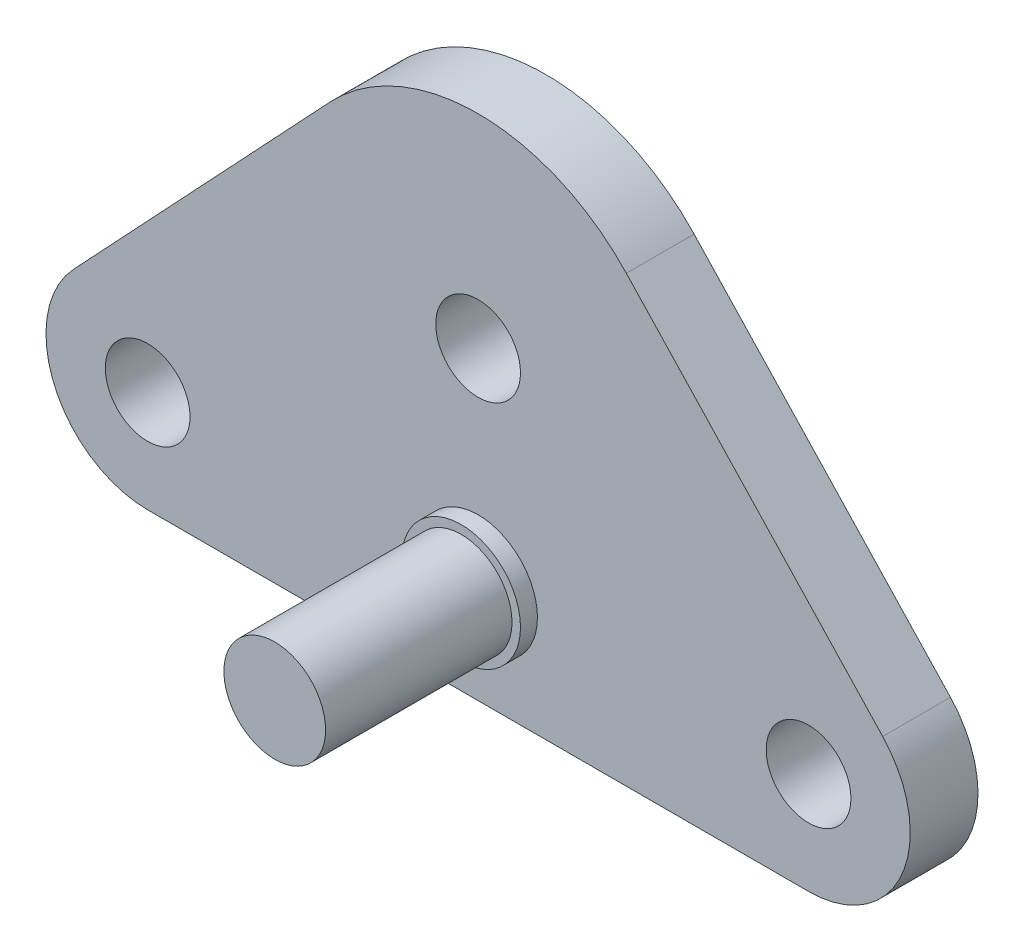
ISO-10303-21;
HEADER;
FILE_DESCRIPTION(('STEP AP214'),'2;1');
FILE_NAME('part.step','',(''),(''),'','','');
FILE_SCHEMA(('AUTOMOTIVE_DESIGN { 1 0 10303 214 1 1 1 1 }'));
ENDSEC;
DATA;
#1=APPLICATION_CONTEXT('core data for automotive mechanical design processes');
#2=APPLICATION_PROTOCOL_DEFINITION('international standard','automotive_design',2000,#1);
#3=PRODUCT_CONTEXT('',#1,'mechanical');
#4=PRODUCT('Part','Part','',(#3));
#5=PRODUCT_RELATED_PRODUCT_CATEGORY('part','',(#4));
#6=PRODUCT_DEFINITION_FORMATION('','',#4);
#7=PRODUCT_DEFINITION_CONTEXT('part definition',#1,'design');
#8=PRODUCT_DEFINITION('design','',#6,#7);
#9=PRODUCT_DEFINITION_SHAPE('','',#8);
#10=(LENGTH_UNIT() NAMED_UNIT(*) SI_UNIT(.MILLI.,.METRE.));
#11=(NAMED_UNIT(*) PLANE_ANGLE_UNIT() SI_UNIT($,.RADIAN.));
#12=(NAMED_UNIT(*) SI_UNIT($,.STERADIAN.) SOLID_ANGLE_UNIT());
#13=UNCERTAINTY_MEASURE_WITH_UNIT(LENGTH_MEASURE(1.E-05),#10,'distance_accuracy_value','');
#14=(GEOMETRIC_REPRESENTATION_CONTEXT(3) GLOBAL_UNCERTAINTY_ASSIGNED_CONTEXT((#13)) GLOBAL_UNIT_ASSIGNED_CONTEXT((#10,
#11,#12)) REPRESENTATION_CONTEXT('',''));
#15=CARTESIAN_POINT('',(0.,0.,0.));
#16=DIRECTION('',(0.,0.,1.));
#17=DIRECTION('',(1.,0.,0.));
#18=AXIS2_PLACEMENT_3D('',#15,#16,#17);
#19=CARTESIAN_POINT('',(-9.75,0.,2.));
#20=DIRECTION('',(0.,0.,1.));
#21=DIRECTION('',(1.,0.,0.));
#22=AXIS2_PLACEMENT_3D('',#19,#20,#21);
#23=PLANE('',#22);
#24=CARTESIAN_POINT('',(0.,0.,2.));
#25=DIRECTION('',(0.,0.,1.));
#26=DIRECTION('',(1.,0.,0.));
#27=AXIS2_PLACEMENT_3D('',#24,#25,#26);
#28=CIRCLE('',#27,1.75);
#29=CARTESIAN_POINT('',(1.75,0.,2.));
#30=VERTEX_POINT('',#29);
#31=EDGE_CURVE('E219',#30,#30,#28,.T.);
#32=ORIENTED_EDGE('',*,*,#31,.F.);
#33=EDGE_LOOP('',(#32));
#34=FACE_BOUND('',#33,.T.);
#35=CARTESIAN_POINT('',(9.75,0.,2.));
#36=DIRECTION('',(0.,0.,1.));
#37=DIRECTION('',(1.,0.,0.));
#38=AXIS2_PLACEMENT_3D('',#35,#36,#37);
#39=CIRCLE('',#38,1.25);
#40=CARTESIAN_POINT('',(11.,0.,2.));
#41=VERTEX_POINT('',#40);
#42=EDGE_CURVE('E239',#41,#41,#39,.T.);
#43=ORIENTED_EDGE('',*,*,#42,.F.);
#44=EDGE_LOOP('',(#43));
#45=FACE_BOUND('',#44,.T.);
#46=CARTESIAN_POINT('',(-9.75,0.,2.));
#47=DIRECTION('',(0.,0.,1.));
#48=DIRECTION('',(1.,0.,0.));
#49=AXIS2_PLACEMENT_3D('',#46,#47,#48);
#50=CIRCLE('',#49,3.);
#51=CARTESIAN_POINT('',(-11.9368758656813,2.05367328173216,2.));
#52=VERTEX_POINT('',#51);
#53=CARTESIAN_POINT('',(-9.75,-3.,2.));
#54=VERTEX_POINT('',#53);
#55=EDGE_CURVE('E147',#52,#54,#50,.T.);
#56=ORIENTED_EDGE('',*,*,#55,.T.);
#57=DIRECTION('',(1.,0.,0.));
#58=VECTOR('',#57,1.);
#59=CARTESIAN_POINT('',(9.75,-3.,2.));
#60=LINE('',#59,#58);
#61=CARTESIAN_POINT('',(9.75,-3.,2.));
#62=VERTEX_POINT('',#61);
#63=EDGE_CURVE('E95',#54,#62,#60,.T.);
#64=ORIENTED_EDGE('',*,*,#63,.T.);
#65=CARTESIAN_POINT('',(9.75,0.,2.));
#66=DIRECTION('',(0.,0.,1.));
#67=DIRECTION('',(-1.,0.,0.));
#68=AXIS2_PLACEMENT_3D('',#65,#66,#67);
#69=CIRCLE('',#68,3.);
#70=CARTESIAN_POINT('',(11.9368758656813,2.05367328173216,2.));
#71=VERTEX_POINT('',#70);
#72=EDGE_CURVE('E108',#62,#71,#69,.T.);
#73=ORIENTED_EDGE('',*,*,#72,.T.);
#74=DIRECTION('',(-0.684557760577386,0.728958621893776,0.));
#75=VECTOR('',#74,1.);
#76=CARTESIAN_POINT('',(4.37375173136266,10.1073465634643,2.));
#77=LINE('',#76,#75);
#78=CARTESIAN_POINT('',(4.37375173136266,10.1073465634643,2.));
#79=VERTEX_POINT('',#78);
#80=EDGE_CURVE('E102',#71,#79,#77,.T.);
#81=ORIENTED_EDGE('',*,*,#80,.T.);
#82=CARTESIAN_POINT('',(0.,6.,2.));
#83=DIRECTION('',(0.,0.,1.));
#84=DIRECTION('',(-1.,0.,0.));
#85=AXIS2_PLACEMENT_3D('',#82,#83,#84);
#86=CIRCLE('',#85,6.);
#87=CARTESIAN_POINT('',(-4.37375173136266,10.1073465634643,2.));
#88=VERTEX_POINT('',#87);
#89=EDGE_CURVE('E106',#79,#88,#86,.T.);
#90=ORIENTED_EDGE('',*,*,#89,.T.);
#91=DIRECTION('',(-0.684557760577386,-0.728958621893777,0.));
#92=VECTOR('',#91,1.);
#93=CARTESIAN_POINT('',(-4.37375173136266,10.1073465634643,2.));
#94=LINE('',#93,#92);
#95=EDGE_CURVE('E58',#88,#52,#94,.T.);
#96=ORIENTED_EDGE('',*,*,#95,.T.);
#97=EDGE_LOOP('',(#56,#64,#73,#81,#90,#96));
#98=FACE_BOUND('',#97,.T.);
#99=CARTESIAN_POINT('',(0.,6.,2.));
#100=DIRECTION('',(0.,0.,1.));
#101=DIRECTION('',(1.,0.,0.));
#102=AXIS2_PLACEMENT_3D('',#99,#100,#101);
#103=CIRCLE('',#102,1.25);
#104=CARTESIAN_POINT('',(1.25,6.,2.));
#105=VERTEX_POINT('',#104);
#106=EDGE_CURVE('E135',#105,#105,#103,.T.);
#107=ORIENTED_EDGE('',*,*,#106,.F.);
#108=EDGE_LOOP('',(#107));
#109=FACE_BOUND('',#108,.T.);
#110=CARTESIAN_POINT('',(-9.75,0.,2.));
#111=DIRECTION('',(0.,0.,1.));
#112=DIRECTION('',(1.,0.,0.));
#113=AXIS2_PLACEMENT_3D('',#110,#111,#112);
#114=CIRCLE('',#113,1.25);
#115=CARTESIAN_POINT('',(-8.5,0.,2.));
#116=VERTEX_POINT('',#115);
#117=EDGE_CURVE('E231',#116,#116,#114,.T.);
#118=ORIENTED_EDGE('',*,*,#117,.F.);
#119=EDGE_LOOP('',(#118));
#120=FACE_BOUND('',#119,.T.);
#121=ADVANCED_FACE('F39',(#34,#45,#98,#109,#120),#23,.T.);
#122=CARTESIAN_POINT('',(-9.75,0.,0.));
#123=DIRECTION('',(0.,0.,1.));
#124=DIRECTION('',(1.,0.,0.));
#125=AXIS2_PLACEMENT_3D('',#122,#123,#124);
#126=PLANE('',#125);
#127=CARTESIAN_POINT('',(-9.75,0.,0.));
#128=DIRECTION('',(0.,0.,1.));
#129=DIRECTION('',(1.,0.,0.));
#130=AXIS2_PLACEMENT_3D('',#127,#128,#129);
#131=CIRCLE('',#130,3.);
#132=CARTESIAN_POINT('',(-11.9368758656813,2.05367328173216,0.));
#133=VERTEX_POINT('',#132);
#134=CARTESIAN_POINT('',(-9.75,-3.,0.));
#135=VERTEX_POINT('',#134);
#136=EDGE_CURVE('E130',#133,#135,#131,.T.);
#137=ORIENTED_EDGE('',*,*,#136,.F.);
#138=DIRECTION('',(-0.684557760577386,-0.728958621893777,0.));
#139=VECTOR('',#138,1.);
#140=CARTESIAN_POINT('',(-4.37375173136266,10.1073465634643,0.));
#141=LINE('',#140,#139);
#142=CARTESIAN_POINT('',(-4.37375173136266,10.1073465634643,0.));
#143=VERTEX_POINT('',#142);
#144=EDGE_CURVE('E87',#143,#133,#141,.T.);
#145=ORIENTED_EDGE('',*,*,#144,.F.);
#146=CARTESIAN_POINT('',(0.,6.,0.));
#147=DIRECTION('',(0.,0.,1.));
#148=DIRECTION('',(-1.,0.,0.));
#149=AXIS2_PLACEMENT_3D('',#146,#147,#148);
#150=CIRCLE('',#149,6.);
#151=CARTESIAN_POINT('',(4.37375173136266,10.1073465634643,0.));
#152=VERTEX_POINT('',#151);
#153=EDGE_CURVE('E81',#152,#143,#150,.T.);
#154=ORIENTED_EDGE('',*,*,#153,.F.);
#155=DIRECTION('',(-0.684557760577386,0.728958621893776,0.));
#156=VECTOR('',#155,1.);
#157=CARTESIAN_POINT('',(4.37375173136266,10.1073465634643,0.));
#158=LINE('',#157,#156);
#159=CARTESIAN_POINT('',(11.9368758656813,2.05367328173216,0.));
#160=VERTEX_POINT('',#159);
#161=EDGE_CURVE('E117',#160,#152,#158,.T.);
#162=ORIENTED_EDGE('',*,*,#161,.F.);
#163=CARTESIAN_POINT('',(9.75,0.,0.));
#164=DIRECTION('',(0.,0.,1.));
#165=DIRECTION('',(-1.,0.,0.));
#166=AXIS2_PLACEMENT_3D('',#163,#164,#165);
#167=CIRCLE('',#166,3.);
#168=CARTESIAN_POINT('',(9.75,-3.,0.));
#169=VERTEX_POINT('',#168);
#170=EDGE_CURVE('E138',#169,#160,#167,.T.);
#171=ORIENTED_EDGE('',*,*,#170,.F.);
#172=DIRECTION('',(1.,0.,0.));
#173=VECTOR('',#172,1.);
#174=CARTESIAN_POINT('',(9.75,-3.,0.));
#175=LINE('',#174,#173);
#176=EDGE_CURVE('E134',#135,#169,#175,.T.);
#177=ORIENTED_EDGE('',*,*,#176,.F.);
#178=EDGE_LOOP('',(#137,#145,#154,#162,#171,#177));
#179=FACE_BOUND('',#178,.T.);
#180=CARTESIAN_POINT('',(0.,6.,0.));
#181=DIRECTION('',(0.,0.,1.));
#182=DIRECTION('',(1.,0.,0.));
#183=AXIS2_PLACEMENT_3D('',#180,#181,#182);
#184=CIRCLE('',#183,1.25);
#185=CARTESIAN_POINT('',(1.25,6.,0.));
#186=VERTEX_POINT('',#185);
#187=EDGE_CURVE('E243',#186,#186,#184,.T.);
#188=ORIENTED_EDGE('',*,*,#187,.T.);
#189=EDGE_LOOP('',(#188));
#190=FACE_BOUND('',#189,.T.);
#191=CARTESIAN_POINT('',(9.75,0.,0.));
#192=DIRECTION('',(0.,0.,1.));
#193=DIRECTION('',(1.,0.,0.));
#194=AXIS2_PLACEMENT_3D('',#191,#192,#193);
#195=CIRCLE('',#194,1.25);
#196=CARTESIAN_POINT('',(11.,0.,0.));
#197=VERTEX_POINT('',#196);
#198=EDGE_CURVE('E235',#197,#197,#195,.T.);
#199=ORIENTED_EDGE('',*,*,#198,.T.);
#200=EDGE_LOOP('',(#199));
#201=FACE_BOUND('',#200,.T.);
#202=CARTESIAN_POINT('',(-9.75,0.,0.));
#203=DIRECTION('',(0.,0.,1.));
#204=DIRECTION('',(1.,0.,0.));
#205=AXIS2_PLACEMENT_3D('',#202,#203,#204);
#206=CIRCLE('',#205,1.25);
#207=CARTESIAN_POINT('',(-8.5,0.,0.));
#208=VERTEX_POINT('',#207);
#209=EDGE_CURVE('E230',#208,#208,#206,.T.);
#210=ORIENTED_EDGE('',*,*,#209,.T.);
#211=EDGE_LOOP('',(#210));
#212=FACE_BOUND('',#211,.T.);
#213=ADVANCED_FACE('F161',(#179,#190,#201,#212),#126,.F.);
#214=CARTESIAN_POINT('',(-9.75,0.,2.));
#215=DIRECTION('',(0.,0.,-1.));
#216=DIRECTION('',(-1.,0.,0.));
#217=AXIS2_PLACEMENT_3D('',#214,#215,#216);
#218=CYLINDRICAL_SURFACE('',#217,3.);
#219=ORIENTED_EDGE('',*,*,#136,.T.);
#220=DIRECTION('',(0.,0.,-1.));
#221=VECTOR('',#220,1.);
#222=CARTESIAN_POINT('',(-9.75,-3.,2.));
#223=LINE('',#222,#221);
#224=EDGE_CURVE('E11',#54,#135,#223,.T.);
#225=ORIENTED_EDGE('',*,*,#224,.F.);
#226=ORIENTED_EDGE('',*,*,#55,.F.);
#227=DIRECTION('',(0.,0.,-1.));
#228=VECTOR('',#227,1.);
#229=CARTESIAN_POINT('',(-11.9368758656813,2.05367328173216,2.));
#230=LINE('',#229,#228);
#231=EDGE_CURVE('E126',#52,#133,#230,.T.);
#232=ORIENTED_EDGE('',*,*,#231,.T.);
#233=EDGE_LOOP('',(#219,#225,#226,#232));
#234=FACE_BOUND('',#233,.T.);
#235=ADVANCED_FACE('F41',(#234),#218,.T.);
#236=CARTESIAN_POINT('',(9.75,-3.,2.));
#237=DIRECTION('',(0.,1.,0.));
#238=DIRECTION('',(-1.,0.,0.));
#239=AXIS2_PLACEMENT_3D('',#236,#237,#238);
#240=PLANE('',#239);
#241=ORIENTED_EDGE('',*,*,#176,.T.);
#242=DIRECTION('',(0.,0.,-1.));
#243=VECTOR('',#242,1.);
#244=CARTESIAN_POINT('',(9.75,-3.,2.));
#245=LINE('',#244,#243);
#246=EDGE_CURVE('E50',#62,#169,#245,.T.);
#247=ORIENTED_EDGE('',*,*,#246,.F.);
#248=ORIENTED_EDGE('',*,*,#63,.F.);
#249=ORIENTED_EDGE('',*,*,#224,.T.);
#250=EDGE_LOOP('',(#241,#247,#248,#249));
#251=FACE_BOUND('',#250,.T.);
#252=ADVANCED_FACE('F314',(#251),#240,.F.);
#253=CARTESIAN_POINT('',(9.75,0.,2.));
#254=DIRECTION('',(0.,0.,-1.));
#255=DIRECTION('',(-1.,0.,0.));
#256=AXIS2_PLACEMENT_3D('',#253,#254,#255);
#257=CYLINDRICAL_SURFACE('',#256,3.);
#258=ORIENTED_EDGE('',*,*,#170,.T.);
#259=DIRECTION('',(0.,0.,-1.));
#260=VECTOR('',#259,1.);
#261=CARTESIAN_POINT('',(11.9368758656813,2.05367328173216,2.));
#262=LINE('',#261,#260);
#263=EDGE_CURVE('E119',#71,#160,#262,.T.);
#264=ORIENTED_EDGE('',*,*,#263,.F.);
#265=ORIENTED_EDGE('',*,*,#72,.F.);
#266=ORIENTED_EDGE('',*,*,#246,.T.);
#267=EDGE_LOOP('',(#258,#264,#265,#266));
#268=FACE_BOUND('',#267,.T.);
#269=ADVANCED_FACE('F158',(#268),#257,.T.);
#270=CARTESIAN_POINT('',(4.37375173136266,10.1073465634643,2.));
#271=DIRECTION('',(-0.728958621893777,-0.684557760577386,0.));
#272=DIRECTION('',(0.684557760577386,-0.728958621893777,0.));
#273=AXIS2_PLACEMENT_3D('',#270,#271,#272);
#274=PLANE('',#273);
#275=ORIENTED_EDGE('',*,*,#161,.T.);
#276=DIRECTION('',(0.,0.,-1.));
#277=VECTOR('',#276,1.);
#278=CARTESIAN_POINT('',(4.37375173136266,10.1073465634643,2.));
#279=LINE('',#278,#277);
#280=EDGE_CURVE('E114',#79,#152,#279,.T.);
#281=ORIENTED_EDGE('',*,*,#280,.F.);
#282=ORIENTED_EDGE('',*,*,#80,.F.);
#283=ORIENTED_EDGE('',*,*,#263,.T.);
#284=EDGE_LOOP('',(#275,#281,#282,#283));
#285=FACE_BOUND('',#284,.T.);
#286=ADVANCED_FACE('F115',(#285),#274,.F.);
#287=CARTESIAN_POINT('',(0.,6.,2.));
#288=DIRECTION('',(0.,0.,-1.));
#289=DIRECTION('',(-1.,0.,0.));
#290=AXIS2_PLACEMENT_3D('',#287,#288,#289);
#291=CYLINDRICAL_SURFACE('',#290,6.);
#292=ORIENTED_EDGE('',*,*,#153,.T.);
#293=DIRECTION('',(0.,0.,-1.));
#294=VECTOR('',#293,1.);
#295=CARTESIAN_POINT('',(-4.37375173136266,10.1073465634643,2.));
#296=LINE('',#295,#294);
#297=EDGE_CURVE('E120',#88,#143,#296,.T.);
#298=ORIENTED_EDGE('',*,*,#297,.F.);
#299=ORIENTED_EDGE('',*,*,#89,.F.);
#300=ORIENTED_EDGE('',*,*,#280,.T.);
#301=EDGE_LOOP('',(#292,#298,#299,#300));
#302=FACE_BOUND('',#301,.T.);
#303=ADVANCED_FACE('F122',(#302),#291,.T.);
#304=CARTESIAN_POINT('',(-4.37375173136266,10.1073465634643,2.));
#305=DIRECTION('',(0.728958621893777,-0.684557760577386,0.));
#306=DIRECTION('',(0.684557760577386,0.728958621893777,0.));
#307=AXIS2_PLACEMENT_3D('',#304,#305,#306);
#308=PLANE('',#307);
#309=ORIENTED_EDGE('',*,*,#144,.T.);
#310=ORIENTED_EDGE('',*,*,#231,.F.);
#311=ORIENTED_EDGE('',*,*,#95,.F.);
#312=ORIENTED_EDGE('',*,*,#297,.T.);
#313=EDGE_LOOP('',(#309,#310,#311,#312));
#314=FACE_BOUND('',#313,.T.);
#315=ADVANCED_FACE('F166',(#314),#308,.F.);
#316=CARTESIAN_POINT('',(0.,6.,2.));
#317=DIRECTION('',(0.,0.,-1.));
#318=DIRECTION('',(-1.,0.,0.));
#319=AXIS2_PLACEMENT_3D('',#316,#317,#318);
#320=CYLINDRICAL_SURFACE('',#319,1.25);
#321=ORIENTED_EDGE('',*,*,#106,.T.);
#322=EDGE_LOOP('',(#321));
#323=FACE_BOUND('',#322,.T.);
#324=ORIENTED_EDGE('',*,*,#187,.F.);
#325=EDGE_LOOP('',(#324));
#326=FACE_BOUND('',#325,.T.);
#327=ADVANCED_FACE('F168',(#323,#326),#320,.F.);
#328=CARTESIAN_POINT('',(9.75,0.,2.));
#329=DIRECTION('',(0.,0.,-1.));
#330=DIRECTION('',(-1.,0.,0.));
#331=AXIS2_PLACEMENT_3D('',#328,#329,#330);
#332=CYLINDRICAL_SURFACE('',#331,1.25);
#333=ORIENTED_EDGE('',*,*,#42,.T.);
#334=EDGE_LOOP('',(#333));
#335=FACE_BOUND('',#334,.T.);
#336=ORIENTED_EDGE('',*,*,#198,.F.);
#337=EDGE_LOOP('',(#336));
#338=FACE_BOUND('',#337,.T.);
#339=ADVANCED_FACE('F174',(#335,#338),#332,.F.);
#340=CARTESIAN_POINT('',(-9.75,0.,2.));
#341=DIRECTION('',(0.,0.,-1.));
#342=DIRECTION('',(-1.,0.,0.));
#343=AXIS2_PLACEMENT_3D('',#340,#341,#342);
#344=CYLINDRICAL_SURFACE('',#343,1.25);
#345=ORIENTED_EDGE('',*,*,#117,.T.);
#346=EDGE_LOOP('',(#345));
#347=FACE_BOUND('',#346,.T.);
#348=ORIENTED_EDGE('',*,*,#209,.F.);
#349=EDGE_LOOP('',(#348));
#350=FACE_BOUND('',#349,.T.);
#351=ADVANCED_FACE('F190',(#347,#350),#344,.F.);
#352=CARTESIAN_POINT('',(0.,0.,2.5));
#353=DIRECTION('',(0.,0.,-1.));
#354=DIRECTION('',(-1.,0.,0.));
#355=AXIS2_PLACEMENT_3D('',#352,#353,#354);
#356=CYLINDRICAL_SURFACE('',#355,1.75);
#357=CARTESIAN_POINT('',(0.,0.,2.5));
#358=DIRECTION('',(0.,0.,1.));
#359=DIRECTION('',(1.,0.,0.));
#360=AXIS2_PLACEMENT_3D('',#357,#358,#359);
#361=CIRCLE('',#360,1.75);
#362=CARTESIAN_POINT('',(1.75,0.,2.5));
#363=VERTEX_POINT('',#362);
#364=EDGE_CURVE('E217',#363,#363,#361,.T.);
#365=ORIENTED_EDGE('',*,*,#364,.F.);
#366=EDGE_LOOP('',(#365));
#367=FACE_BOUND('',#366,.T.);
#368=ORIENTED_EDGE('',*,*,#31,.T.);
#369=EDGE_LOOP('',(#368));
#370=FACE_BOUND('',#369,.T.);
#371=ADVANCED_FACE('F194',(#367,#370),#356,.T.);
#372=CARTESIAN_POINT('',(0.,0.,2.5));
#373=DIRECTION('',(0.,0.,1.));
#374=DIRECTION('',(1.,0.,0.));
#375=AXIS2_PLACEMENT_3D('',#372,#373,#374);
#376=PLANE('',#375);
#377=CARTESIAN_POINT('',(0.,0.,2.5));
#378=DIRECTION('',(0.,0.,1.));
#379=DIRECTION('',(1.,0.,0.));
#380=AXIS2_PLACEMENT_3D('',#377,#378,#379);
#381=CIRCLE('',#380,1.5);
#382=CARTESIAN_POINT('',(1.5,0.,2.5));
#383=VERTEX_POINT('',#382);
#384=EDGE_CURVE('E43',#383,#383,#381,.T.);
#385=ORIENTED_EDGE('',*,*,#384,.F.);
#386=EDGE_LOOP('',(#385));
#387=FACE_BOUND('',#386,.T.);
#388=ORIENTED_EDGE('',*,*,#364,.T.);
#389=EDGE_LOOP('',(#388));
#390=FACE_BOUND('',#389,.T.);
#391=ADVANCED_FACE('F203',(#387,#390),#376,.T.);
#392=CARTESIAN_POINT('',(0.,0.,8.));
#393=DIRECTION('',(0.,0.,1.));
#394=DIRECTION('',(1.,0.,0.));
#395=AXIS2_PLACEMENT_3D('',#392,#393,#394);
#396=PLANE('',#395);
#397=CARTESIAN_POINT('',(0.,0.,8.));
#398=DIRECTION('',(0.,0.,1.));
#399=DIRECTION('',(1.,0.,0.));
#400=AXIS2_PLACEMENT_3D('',#397,#398,#399);
#401=CIRCLE('',#400,1.5);
#402=CARTESIAN_POINT('',(1.5,0.,8.));
#403=VERTEX_POINT('',#402);
#404=EDGE_CURVE('E223',#403,#403,#401,.T.);
#405=ORIENTED_EDGE('',*,*,#404,.T.);
#406=EDGE_LOOP('',(#405));
#407=FACE_BOUND('',#406,.T.);
#408=ADVANCED_FACE('F199',(#407),#396,.T.);
#409=CARTESIAN_POINT('',(0.,0.,8.));
#410=DIRECTION('',(0.,0.,-1.));
#411=DIRECTION('',(-1.,0.,0.));
#412=AXIS2_PLACEMENT_3D('',#409,#410,#411);
#413=CYLINDRICAL_SURFACE('',#412,1.5);
#414=ORIENTED_EDGE('',*,*,#384,.T.);
#415=EDGE_LOOP('',(#414));
#416=FACE_BOUND('',#415,.T.);
#417=ORIENTED_EDGE('',*,*,#404,.F.);
#418=EDGE_LOOP('',(#417));
#419=FACE_BOUND('',#418,.T.);
#420=ADVANCED_FACE('F196',(#416,#419),#413,.T.);
#421=CLOSED_SHELL('',(#121,#213,#235,#252,#269,#286,#303,#315,#327,#339,#351,#371,#391,#408,#420));
#422=MANIFOLD_SOLID_BREP('B2',#421);
#423=ADVANCED_BREP_SHAPE_REPRESENTATION('',(#18,#422),#14);
#424=SHAPE_DEFINITION_REPRESENTATION(#9,#423);
ENDSEC;
END-ISO-10303-21;
